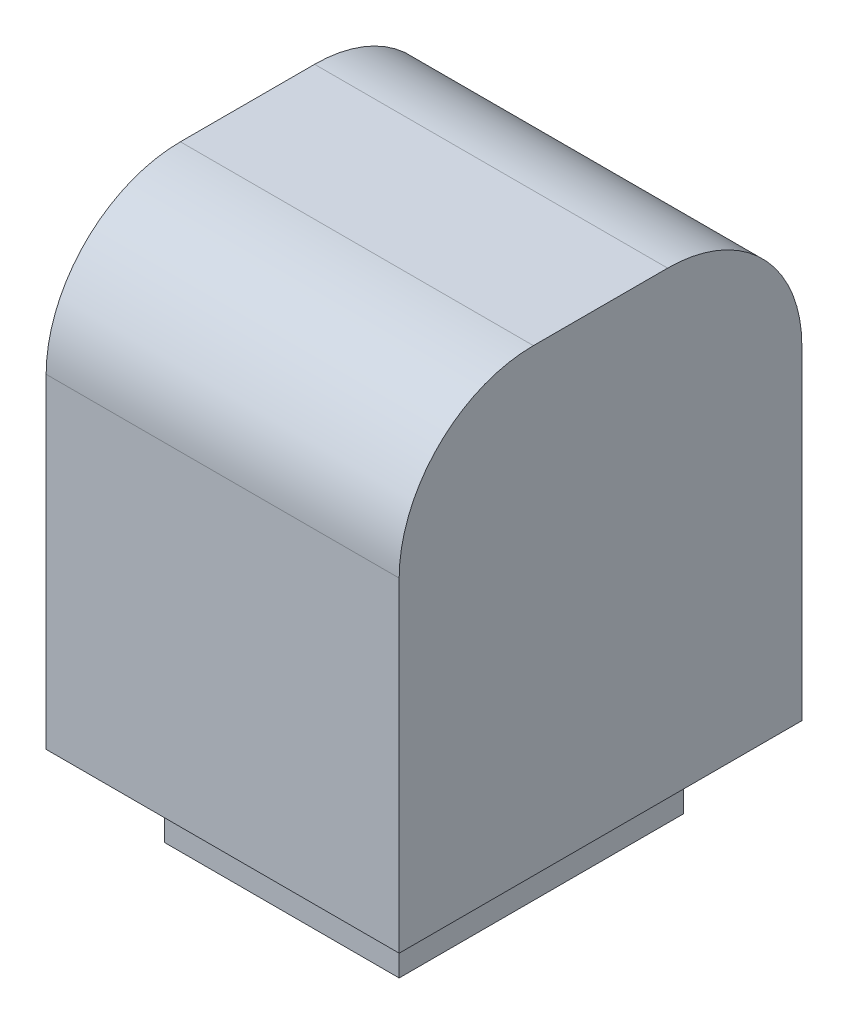
ISO-10303-21;
HEADER;
FILE_DESCRIPTION(('STEP AP214'),'2;1');
FILE_NAME('part.step','',(''),(''),'','','');
FILE_SCHEMA(('AUTOMOTIVE_DESIGN { 1 0 10303 214 1 1 1 1 }'));
ENDSEC;
DATA;
#1=APPLICATION_CONTEXT('core data for automotive mechanical design processes');
#2=APPLICATION_PROTOCOL_DEFINITION('international standard','automotive_design',2000,#1);
#3=PRODUCT_CONTEXT('',#1,'mechanical');
#4=PRODUCT('Part','Part','',(#3));
#5=PRODUCT_RELATED_PRODUCT_CATEGORY('part','',(#4));
#6=PRODUCT_DEFINITION_FORMATION('','',#4);
#7=PRODUCT_DEFINITION_CONTEXT('part definition',#1,'design');
#8=PRODUCT_DEFINITION('design','',#6,#7);
#9=PRODUCT_DEFINITION_SHAPE('','',#8);
#10=(LENGTH_UNIT() NAMED_UNIT(*) SI_UNIT(.MILLI.,.METRE.));
#11=(NAMED_UNIT(*) PLANE_ANGLE_UNIT() SI_UNIT($,.RADIAN.));
#12=(NAMED_UNIT(*) SI_UNIT($,.STERADIAN.) SOLID_ANGLE_UNIT());
#13=UNCERTAINTY_MEASURE_WITH_UNIT(LENGTH_MEASURE(1.E-05),#10,'distance_accuracy_value','');
#14=(GEOMETRIC_REPRESENTATION_CONTEXT(3) GLOBAL_UNCERTAINTY_ASSIGNED_CONTEXT((#13)) GLOBAL_UNIT_ASSIGNED_CONTEXT((#10,
#11,#12)) REPRESENTATION_CONTEXT('',''));
#15=CARTESIAN_POINT('',(0.,0.,0.));
#16=DIRECTION('',(0.,0.,1.));
#17=DIRECTION('',(1.,0.,0.));
#18=AXIS2_PLACEMENT_3D('',#15,#16,#17);
#19=CARTESIAN_POINT('',(70.4317654090223,17.6000000000002,0.));
#20=DIRECTION('',(-1.,0.,0.));
#21=DIRECTION('',(0.,-1.,0.));
#22=AXIS2_PLACEMENT_3D('',#19,#20,#21);
#23=CYLINDRICAL_SURFACE('',#22,4.4);
#24=CARTESIAN_POINT('',(21.85,17.6,0.));
#25=DIRECTION('',(-1.,0.,0.));
#26=DIRECTION('',(0.,-1.,0.));
#27=AXIS2_PLACEMENT_3D('',#24,#25,#26);
#28=CIRCLE('',#27,4.4);
#29=CARTESIAN_POINT('',(21.85,13.2,0.));
#30=VERTEX_POINT('',#29);
#31=EDGE_CURVE('E174',#30,#30,#28,.F.);
#32=CARTESIAN_POINT('',(29.2,17.6,0.));
#33=DIRECTION('',(1.,0.,0.));
#34=DIRECTION('',(0.,1.,0.));
#35=AXIS2_PLACEMENT_3D('',#32,#33,#34);
#36=CIRCLE('',#35,4.4);
#37=CARTESIAN_POINT('',(29.2,13.2,0.));
#38=VERTEX_POINT('',#37);
#39=EDGE_CURVE('E340',#38,#38,#36,.F.);
#40=CARTESIAN_POINT('',(21.85,13.2,0.));
#41=CARTESIAN_POINT('',(21.9265625,13.2,0.));
#42=CARTESIAN_POINT('',(22.003125,13.2,0.));
#43=CARTESIAN_POINT('',(22.15625,13.2,0.));
#44=CARTESIAN_POINT('',(22.2328125,13.2,0.));
#45=CARTESIAN_POINT('',(22.3859375,13.2,0.));
#46=CARTESIAN_POINT('',(22.4625,13.2,0.));
#47=CARTESIAN_POINT('',(22.615625,13.2,0.));
#48=CARTESIAN_POINT('',(22.6921875,13.2,0.));
#49=CARTESIAN_POINT('',(22.8453125,13.2,0.));
#50=CARTESIAN_POINT('',(22.921875,13.2,0.));
#51=CARTESIAN_POINT('',(23.075,13.2,0.));
#52=CARTESIAN_POINT('',(23.1515625,13.2,0.));
#53=CARTESIAN_POINT('',(23.3046875,13.2,0.));
#54=CARTESIAN_POINT('',(23.38125,13.2,0.));
#55=CARTESIAN_POINT('',(23.534375,13.2,0.));
#56=CARTESIAN_POINT('',(23.6109375,13.2,0.));
#57=CARTESIAN_POINT('',(23.7640625,13.2,0.));
#58=CARTESIAN_POINT('',(23.840625,13.2,0.));
#59=CARTESIAN_POINT('',(23.99375,13.2,0.));
#60=CARTESIAN_POINT('',(24.0703125,13.2,0.));
#61=CARTESIAN_POINT('',(24.2234375,13.2,0.));
#62=CARTESIAN_POINT('',(24.3,13.2,0.));
#63=CARTESIAN_POINT('',(24.453125,13.2,0.));
#64=CARTESIAN_POINT('',(24.5296875,13.2,0.));
#65=CARTESIAN_POINT('',(24.6828125,13.2,0.));
#66=CARTESIAN_POINT('',(24.759375,13.2,0.));
#67=CARTESIAN_POINT('',(24.9125,13.2,0.));
#68=CARTESIAN_POINT('',(24.9890625,13.2,0.));
#69=CARTESIAN_POINT('',(25.1421875,13.2,0.));
#70=CARTESIAN_POINT('',(25.21875,13.2,0.));
#71=CARTESIAN_POINT('',(25.371875,13.2,0.));
#72=CARTESIAN_POINT('',(25.4484375,13.2,0.));
#73=CARTESIAN_POINT('',(25.6015625,13.2,0.));
#74=CARTESIAN_POINT('',(25.678125,13.2,0.));
#75=CARTESIAN_POINT('',(25.83125,13.2,0.));
#76=CARTESIAN_POINT('',(25.9078125,13.2,0.));
#77=CARTESIAN_POINT('',(26.0609375,13.2,0.));
#78=CARTESIAN_POINT('',(26.1375,13.2,0.));
#79=CARTESIAN_POINT('',(26.290625,13.2,0.));
#80=CARTESIAN_POINT('',(26.3671875,13.2,0.));
#81=CARTESIAN_POINT('',(26.5203125,13.2,0.));
#82=CARTESIAN_POINT('',(26.596875,13.2,0.));
#83=CARTESIAN_POINT('',(26.75,13.2,0.));
#84=CARTESIAN_POINT('',(26.8265625,13.2,0.));
#85=CARTESIAN_POINT('',(26.9796875,13.2,0.));
#86=CARTESIAN_POINT('',(27.05625,13.2,0.));
#87=CARTESIAN_POINT('',(27.209375,13.2,0.));
#88=CARTESIAN_POINT('',(27.2859375,13.2,0.));
#89=CARTESIAN_POINT('',(27.4390625,13.2,0.));
#90=CARTESIAN_POINT('',(27.515625,13.2,0.));
#91=CARTESIAN_POINT('',(27.66875,13.2,0.));
#92=CARTESIAN_POINT('',(27.7453125,13.2,0.));
#93=CARTESIAN_POINT('',(27.8984375,13.2,0.));
#94=CARTESIAN_POINT('',(27.975,13.2,0.));
#95=CARTESIAN_POINT('',(28.128125,13.2,0.));
#96=CARTESIAN_POINT('',(28.2046875,13.2,0.));
#97=CARTESIAN_POINT('',(28.3578125,13.2,0.));
#98=CARTESIAN_POINT('',(28.434375,13.2,0.));
#99=CARTESIAN_POINT('',(28.5875,13.2,0.));
#100=CARTESIAN_POINT('',(28.6640625,13.2,0.));
#101=CARTESIAN_POINT('',(28.8171875,13.2,0.));
#102=CARTESIAN_POINT('',(28.89375,13.2,0.));
#103=CARTESIAN_POINT('',(29.046875,13.2,0.));
#104=CARTESIAN_POINT('',(29.1234375,13.2,0.));
#105=CARTESIAN_POINT('',(29.2,13.2,0.));
#106=B_SPLINE_CURVE_WITH_KNOTS('',3,(#40,#41,#42,#43,#44,#45,#46,#47,#48,#49,#50,#51,#52,#53,
#54,#55,#56,#57,#58,#59,#60,#61,#62,#63,#64,#65,#66,#67,#68,#69,#70,#71,#72,#73,#74,#75,#76,#77,
#78,#79,#80,#81,#82,#83,#84,#85,#86,#87,#88,#89,#90,#91,#92,#93,#94,#95,#96,#97,#98,#99,#100,
#101,#102,#103,#104,#105),.UNSPECIFIED.,.F.,.F.,(4,2,2,2,2,2,2,2,2,2,2,2,2,2,2,2,2,2,2,2,2,2,2,
2,2,2,2,2,2,2,2,2,4),(0.,0.229687499999999,0.459374999999998,0.689062500000004,
0.918750000000003,1.1484375,1.378125,1.6078125,1.83750000000001,2.0671875,2.296875,2.5265625,
2.75625,2.9859375,3.21562500000001,3.44531250000001,3.675,3.9046875,4.134375,4.3640625,
4.59375000000001,4.82343750000001,5.05312500000001,5.2828125,5.5125,5.74218750000001,
5.97187500000001,6.20156250000001,6.43125000000001,6.66093750000001,6.89062500000001,
7.12031250000001,7.35000000000001),.UNSPECIFIED.);
#107=EDGE_CURVE('BSEAM54',#30,#38,#106,.T.);
#108=ORIENTED_EDGE('',*,*,#31,.F.);
#109=ORIENTED_EDGE('',*,*,#39,.F.);
#110=ORIENTED_EDGE('',*,*,#107,.T.);
#111=ORIENTED_EDGE('',*,*,#107,.F.);
#112=EDGE_LOOP('',(#108,#110,#109,#111));
#113=FACE_BOUND('',#112,.T.);
#114=ADVANCED_FACE('F54',(#113),#23,.F.);
#115=CARTESIAN_POINT('',(-12.3585850404241,7.50000000000005,15.3722744776752));
#116=DIRECTION('',(0.,1.,0.));
#117=DIRECTION('',(0.,0.,1.));
#118=AXIS2_PLACEMENT_3D('',#115,#116,#117);
#119=PLANE('',#118);
#120=DIRECTION('',(0.,0.,1.));
#121=VECTOR('',#120,1.);
#122=CARTESIAN_POINT('',(35.,7.50000000000005,15.3722744776752));
#123=LINE('',#122,#121);
#124=CARTESIAN_POINT('',(35.,7.50000000000005,-7.49999999999995));
#125=VERTEX_POINT('',#124);
#126=CARTESIAN_POINT('',(35.,7.50000000000005,7.50000000000011));
#127=VERTEX_POINT('',#126);
#128=EDGE_CURVE('E159',#125,#127,#123,.T.);
#129=ORIENTED_EDGE('',*,*,#128,.T.);
#130=DIRECTION('',(1.,0.,0.));
#131=VECTOR('',#130,1.);
#132=CARTESIAN_POINT('',(70.4317654090224,7.50000000000005,7.50000000000011));
#133=LINE('',#132,#131);
#134=CARTESIAN_POINT('',(21.85,7.50000000000005,7.50000000000003));
#135=VERTEX_POINT('',#134);
#136=EDGE_CURVE('E162',#135,#127,#133,.T.);
#137=ORIENTED_EDGE('',*,*,#136,.F.);
#138=DIRECTION('',(0.,0.,-1.));
#139=VECTOR('',#138,1.);
#140=CARTESIAN_POINT('',(21.85,7.50000000000005,-0.994929888904086));
#141=LINE('',#140,#139);
#142=CARTESIAN_POINT('',(21.8500000000001,7.50000000000005,-7.50000000000002));
#143=VERTEX_POINT('',#142);
#144=EDGE_CURVE('E189',#135,#143,#141,.T.);
#145=ORIENTED_EDGE('',*,*,#144,.T.);
#146=DIRECTION('',(-1.,0.,0.));
#147=VECTOR('',#146,1.);
#148=CARTESIAN_POINT('',(70.4317654090225,7.50000000000005,-7.49999999999988));
#149=LINE('',#148,#147);
#150=EDGE_CURVE('E170',#125,#143,#149,.T.);
#151=ORIENTED_EDGE('',*,*,#150,.F.);
#152=EDGE_LOOP('',(#129,#137,#145,#151));
#153=FACE_BOUND('',#152,.T.);
#154=DIRECTION('',(0.,0.,1.));
#155=VECTOR('',#154,1.);
#156=CARTESIAN_POINT('',(32.8,7.50000000000005,5.30000000000004));
#157=LINE('',#156,#155);
#158=CARTESIAN_POINT('',(32.8,7.50000000000005,-5.29999999999995));
#159=VERTEX_POINT('',#158);
#160=CARTESIAN_POINT('',(32.8,7.50000000000005,5.30000000000004));
#161=VERTEX_POINT('',#160);
#162=EDGE_CURVE('E158',#159,#161,#157,.T.);
#163=ORIENTED_EDGE('',*,*,#162,.F.);
#164=DIRECTION('',(1.,0.,0.));
#165=VECTOR('',#164,1.);
#166=CARTESIAN_POINT('',(32.8,7.50000000000005,-5.29999999999995));
#167=LINE('',#166,#165);
#168=CARTESIAN_POINT('',(24.05,7.50000000000005,-5.29999999999995));
#169=VERTEX_POINT('',#168);
#170=EDGE_CURVE('E155',#169,#159,#167,.T.);
#171=ORIENTED_EDGE('',*,*,#170,.F.);
#172=DIRECTION('',(0.,0.,-1.));
#173=VECTOR('',#172,1.);
#174=CARTESIAN_POINT('',(24.05,7.50000000000005,5.30000000000003));
#175=LINE('',#174,#173);
#176=CARTESIAN_POINT('',(24.05,7.50000000000005,5.30000000000003));
#177=VERTEX_POINT('',#176);
#178=EDGE_CURVE('E332',#177,#169,#175,.T.);
#179=ORIENTED_EDGE('',*,*,#178,.F.);
#180=DIRECTION('',(-1.,0.,0.));
#181=VECTOR('',#180,1.);
#182=CARTESIAN_POINT('',(32.8,7.50000000000005,5.30000000000004));
#183=LINE('',#182,#181);
#184=EDGE_CURVE('E338',#161,#177,#183,.T.);
#185=ORIENTED_EDGE('',*,*,#184,.F.);
#186=EDGE_LOOP('',(#163,#171,#179,#185));
#187=FACE_BOUND('',#186,.T.);
#188=ADVANCED_FACE('F219',(#153,#187),#119,.F.);
#189=CARTESIAN_POINT('',(70.4317654090223,24.6000000000002,7.50000000000012));
#190=DIRECTION('',(0.,-1.,0.));
#191=DIRECTION('',(1.,0.,0.));
#192=AXIS2_PLACEMENT_3D('',#189,#190,#191);
#193=PLANE('',#192);
#194=DIRECTION('',(0.,0.,1.));
#195=VECTOR('',#194,1.);
#196=CARTESIAN_POINT('',(35.,24.6,7.50000000000011));
#197=LINE('',#196,#195);
#198=CARTESIAN_POINT('',(35.,24.6,-2.49999999999994));
#199=VERTEX_POINT('',#198);
#200=CARTESIAN_POINT('',(35.,24.6,2.50000000000006));
#201=VERTEX_POINT('',#200);
#202=EDGE_CURVE('E177',#199,#201,#197,.T.);
#203=ORIENTED_EDGE('',*,*,#202,.F.);
#204=DIRECTION('',(-1.,0.,0.));
#205=VECTOR('',#204,1.);
#206=CARTESIAN_POINT('',(70.4317654090223,24.6000000000002,-2.49999999999988));
#207=LINE('',#206,#205);
#208=CARTESIAN_POINT('',(21.85,24.6,-2.49999999999996));
#209=VERTEX_POINT('',#208);
#210=EDGE_CURVE('E193',#199,#209,#207,.T.);
#211=ORIENTED_EDGE('',*,*,#210,.T.);
#212=DIRECTION('',(0.,0.,1.));
#213=VECTOR('',#212,1.);
#214=CARTESIAN_POINT('',(21.85,24.6,7.50000000000001));
#215=LINE('',#214,#213);
#216=CARTESIAN_POINT('',(21.85,24.6,2.50000000000004));
#217=VERTEX_POINT('',#216);
#218=EDGE_CURVE('E180',#209,#217,#215,.T.);
#219=ORIENTED_EDGE('',*,*,#218,.T.);
#220=DIRECTION('',(-1.,0.,0.));
#221=VECTOR('',#220,1.);
#222=CARTESIAN_POINT('',(70.4317654090223,24.6000000000002,2.50000000000011));
#223=LINE('',#222,#221);
#224=EDGE_CURVE('E191',#217,#201,#223,.F.);
#225=ORIENTED_EDGE('',*,*,#224,.T.);
#226=EDGE_LOOP('',(#203,#211,#219,#225));
#227=FACE_BOUND('',#226,.T.);
#228=ADVANCED_FACE('F208',(#227),#193,.F.);
#229=CARTESIAN_POINT('',(70.4317654090225,-7.49999999999982,-7.49999999999988));
#230=DIRECTION('',(0.,0.,1.));
#231=DIRECTION('',(1.,0.,0.));
#232=AXIS2_PLACEMENT_3D('',#229,#230,#231);
#233=PLANE('',#232);
#234=DIRECTION('',(0.,1.,0.));
#235=VECTOR('',#234,1.);
#236=CARTESIAN_POINT('',(21.8500000000001,-7.49999999999999,-7.49999999999996));
#237=LINE('',#236,#235);
#238=CARTESIAN_POINT('',(21.85,19.6,-7.49999999999996));
#239=VERTEX_POINT('',#238);
#240=EDGE_CURVE('E178',#143,#239,#237,.T.);
#241=ORIENTED_EDGE('',*,*,#240,.T.);
#242=DIRECTION('',(-1.,0.,0.));
#243=VECTOR('',#242,1.);
#244=CARTESIAN_POINT('',(70.4317654090224,19.6000000000002,-7.49999999999988));
#245=LINE('',#244,#243);
#246=CARTESIAN_POINT('',(35.,19.6,-7.49999999999994));
#247=VERTEX_POINT('',#246);
#248=EDGE_CURVE('E77',#239,#247,#245,.F.);
#249=ORIENTED_EDGE('',*,*,#248,.T.);
#250=DIRECTION('',(0.,1.,0.));
#251=VECTOR('',#250,1.);
#252=CARTESIAN_POINT('',(35.,-7.49999999999982,-7.49999999999994));
#253=LINE('',#252,#251);
#254=EDGE_CURVE('E185',#125,#247,#253,.T.);
#255=ORIENTED_EDGE('',*,*,#254,.F.);
#256=ORIENTED_EDGE('',*,*,#150,.T.);
#257=EDGE_LOOP('',(#241,#249,#255,#256));
#258=FACE_BOUND('',#257,.T.);
#259=ADVANCED_FACE('F217',(#258),#233,.F.);
#260=CARTESIAN_POINT('',(70.4317654090224,-7.49999999999982,7.50000000000011));
#261=DIRECTION('',(0.,0.,-1.));
#262=DIRECTION('',(-1.,0.,0.));
#263=AXIS2_PLACEMENT_3D('',#260,#261,#262);
#264=PLANE('',#263);
#265=DIRECTION('',(0.,-1.,0.));
#266=VECTOR('',#265,1.);
#267=CARTESIAN_POINT('',(35.,-7.49999999999982,7.50000000000006));
#268=LINE('',#267,#266);
#269=CARTESIAN_POINT('',(35.,19.6,7.50000000000005));
#270=VERTEX_POINT('',#269);
#271=EDGE_CURVE('E187',#270,#127,#268,.T.);
#272=ORIENTED_EDGE('',*,*,#271,.F.);
#273=DIRECTION('',(-1.,0.,0.));
#274=VECTOR('',#273,1.);
#275=CARTESIAN_POINT('',(70.4317654090223,19.6000000000002,7.50000000000012));
#276=LINE('',#275,#274);
#277=CARTESIAN_POINT('',(21.85,19.6,7.50000000000004));
#278=VERTEX_POINT('',#277);
#279=EDGE_CURVE('E14',#270,#278,#276,.T.);
#280=ORIENTED_EDGE('',*,*,#279,.T.);
#281=DIRECTION('',(0.,-1.,0.));
#282=VECTOR('',#281,1.);
#283=CARTESIAN_POINT('',(21.8500000000001,-7.49999999999999,7.50000000000003));
#284=LINE('',#283,#282);
#285=EDGE_CURVE('E173',#278,#135,#284,.T.);
#286=ORIENTED_EDGE('',*,*,#285,.T.);
#287=ORIENTED_EDGE('',*,*,#136,.T.);
#288=EDGE_LOOP('',(#272,#280,#286,#287));
#289=FACE_BOUND('',#288,.T.);
#290=ADVANCED_FACE('F224',(#289),#264,.F.);
#291=CARTESIAN_POINT('',(35.,-7.49999999999994,-5.65333808855278));
#292=DIRECTION('',(1.,0.,0.));
#293=DIRECTION('',(0.,0.,-1.));
#294=AXIS2_PLACEMENT_3D('',#291,#292,#293);
#295=PLANE('',#294);
#296=ORIENTED_EDGE('',*,*,#254,.T.);
#297=CARTESIAN_POINT('',(35.,19.6,-2.49999999999994));
#298=DIRECTION('',(1.,0.,0.));
#299=DIRECTION('',(0.,0.,-1.));
#300=AXIS2_PLACEMENT_3D('',#297,#298,#299);
#301=CIRCLE('',#300,5.);
#302=EDGE_CURVE('E62',#247,#199,#301,.T.);
#303=ORIENTED_EDGE('',*,*,#302,.T.);
#304=ORIENTED_EDGE('',*,*,#202,.T.);
#305=CARTESIAN_POINT('',(35.,19.6,2.50000000000005));
#306=DIRECTION('',(1.,0.,0.));
#307=DIRECTION('',(0.,0.,-1.));
#308=AXIS2_PLACEMENT_3D('',#305,#306,#307);
#309=CIRCLE('',#308,5.);
#310=EDGE_CURVE('E69',#201,#270,#309,.T.);
#311=ORIENTED_EDGE('',*,*,#310,.T.);
#312=ORIENTED_EDGE('',*,*,#271,.T.);
#313=ORIENTED_EDGE('',*,*,#128,.F.);
#314=EDGE_LOOP('',(#296,#303,#304,#311,#312,#313));
#315=FACE_BOUND('',#314,.T.);
#316=ADVANCED_FACE('F203',(#315),#295,.T.);
#317=CARTESIAN_POINT('',(21.85,24.831881810162,-0.994929888904083));
#318=DIRECTION('',(-1.,0.,0.));
#319=DIRECTION('',(0.,-0.136291765603343,-0.990668741118202));
#320=AXIS2_PLACEMENT_3D('',#317,#318,#319);
#321=PLANE('',#320);
#322=ORIENTED_EDGE('',*,*,#218,.F.);
#323=CARTESIAN_POINT('',(21.85,19.6,-2.49999999999996));
#324=DIRECTION('',(-1.,0.,0.));
#325=DIRECTION('',(0.,-1.,0.));
#326=AXIS2_PLACEMENT_3D('',#323,#324,#325);
#327=CIRCLE('',#326,5.);
#328=EDGE_CURVE('E198',#209,#239,#327,.T.);
#329=ORIENTED_EDGE('',*,*,#328,.T.);
#330=ORIENTED_EDGE('',*,*,#240,.F.);
#331=ORIENTED_EDGE('',*,*,#144,.F.);
#332=ORIENTED_EDGE('',*,*,#285,.F.);
#333=CARTESIAN_POINT('',(21.85,19.6,2.50000000000004));
#334=DIRECTION('',(-1.,0.,0.));
#335=DIRECTION('',(0.,-1.,0.));
#336=AXIS2_PLACEMENT_3D('',#333,#334,#335);
#337=CIRCLE('',#336,5.);
#338=EDGE_CURVE('E196',#278,#217,#337,.T.);
#339=ORIENTED_EDGE('',*,*,#338,.T.);
#340=EDGE_LOOP('',(#322,#329,#330,#331,#332,#339));
#341=FACE_BOUND('',#340,.T.);
#342=ORIENTED_EDGE('',*,*,#31,.T.);
#343=EDGE_LOOP('',(#342));
#344=FACE_BOUND('',#343,.T.);
#345=ADVANCED_FACE('F214',(#341,#344),#321,.T.);
#346=CARTESIAN_POINT('',(32.8,4.50000000000005,5.30000000000004));
#347=DIRECTION('',(-1.,0.,0.));
#348=DIRECTION('',(0.,0.,1.));
#349=AXIS2_PLACEMENT_3D('',#346,#347,#348);
#350=PLANE('',#349);
#351=ORIENTED_EDGE('',*,*,#162,.T.);
#352=DIRECTION('',(0.,1.,0.));
#353=VECTOR('',#352,1.);
#354=CARTESIAN_POINT('',(32.8,4.50000000000005,5.30000000000004));
#355=LINE('',#354,#353);
#356=CARTESIAN_POINT('',(32.8,4.50000000000005,5.30000000000004));
#357=VERTEX_POINT('',#356);
#358=EDGE_CURVE('E139',#357,#161,#355,.T.);
#359=ORIENTED_EDGE('',*,*,#358,.F.);
#360=DIRECTION('',(0.,0.,1.));
#361=VECTOR('',#360,1.);
#362=CARTESIAN_POINT('',(32.8,4.50000000000005,5.30000000000004));
#363=LINE('',#362,#361);
#364=CARTESIAN_POINT('',(32.8,4.50000000000005,-5.29999999999995));
#365=VERTEX_POINT('',#364);
#366=EDGE_CURVE('E146',#365,#357,#363,.T.);
#367=ORIENTED_EDGE('',*,*,#366,.F.);
#368=DIRECTION('',(0.,1.,0.));
#369=VECTOR('',#368,1.);
#370=CARTESIAN_POINT('',(32.8,4.50000000000005,-5.29999999999995));
#371=LINE('',#370,#369);
#372=EDGE_CURVE('E329',#365,#159,#371,.T.);
#373=ORIENTED_EDGE('',*,*,#372,.T.);
#374=EDGE_LOOP('',(#351,#359,#367,#373));
#375=FACE_BOUND('',#374,.T.);
#376=ADVANCED_FACE('F157',(#375),#350,.F.);
#377=CARTESIAN_POINT('',(32.8,4.50000000000005,5.30000000000004));
#378=DIRECTION('',(0.,0.,-1.));
#379=DIRECTION('',(-1.,0.,0.));
#380=AXIS2_PLACEMENT_3D('',#377,#378,#379);
#381=PLANE('',#380);
#382=ORIENTED_EDGE('',*,*,#184,.T.);
#383=DIRECTION('',(0.,1.,0.));
#384=VECTOR('',#383,1.);
#385=CARTESIAN_POINT('',(24.05,4.50000000000005,5.30000000000004));
#386=LINE('',#385,#384);
#387=CARTESIAN_POINT('',(24.05,4.50000000000005,5.30000000000004));
#388=VERTEX_POINT('',#387);
#389=EDGE_CURVE('E142',#388,#177,#386,.T.);
#390=ORIENTED_EDGE('',*,*,#389,.F.);
#391=DIRECTION('',(-1.,0.,0.));
#392=VECTOR('',#391,1.);
#393=CARTESIAN_POINT('',(32.8,4.50000000000005,5.30000000000004));
#394=LINE('',#393,#392);
#395=EDGE_CURVE('E134',#357,#388,#394,.T.);
#396=ORIENTED_EDGE('',*,*,#395,.F.);
#397=ORIENTED_EDGE('',*,*,#358,.T.);
#398=EDGE_LOOP('',(#382,#390,#396,#397));
#399=FACE_BOUND('',#398,.T.);
#400=ADVANCED_FACE('F137',(#399),#381,.F.);
#401=CARTESIAN_POINT('',(24.05,4.50000000000005,5.30000000000004));
#402=DIRECTION('',(1.,0.,0.));
#403=DIRECTION('',(0.,0.,-1.));
#404=AXIS2_PLACEMENT_3D('',#401,#402,#403);
#405=PLANE('',#404);
#406=ORIENTED_EDGE('',*,*,#178,.T.);
#407=DIRECTION('',(0.,1.,0.));
#408=VECTOR('',#407,1.);
#409=CARTESIAN_POINT('',(24.05,4.50000000000005,-5.29999999999995));
#410=LINE('',#409,#408);
#411=CARTESIAN_POINT('',(24.05,4.50000000000005,-5.29999999999995));
#412=VERTEX_POINT('',#411);
#413=EDGE_CURVE('E164',#412,#169,#410,.T.);
#414=ORIENTED_EDGE('',*,*,#413,.F.);
#415=DIRECTION('',(0.,0.,-1.));
#416=VECTOR('',#415,1.);
#417=CARTESIAN_POINT('',(24.05,4.50000000000005,5.30000000000004));
#418=LINE('',#417,#416);
#419=EDGE_CURVE('E145',#388,#412,#418,.T.);
#420=ORIENTED_EDGE('',*,*,#419,.F.);
#421=ORIENTED_EDGE('',*,*,#389,.T.);
#422=EDGE_LOOP('',(#406,#414,#420,#421));
#423=FACE_BOUND('',#422,.T.);
#424=ADVANCED_FACE('F265',(#423),#405,.F.);
#425=CARTESIAN_POINT('',(32.8,4.50000000000005,-5.29999999999995));
#426=DIRECTION('',(0.,0.,1.));
#427=DIRECTION('',(1.,0.,0.));
#428=AXIS2_PLACEMENT_3D('',#425,#426,#427);
#429=PLANE('',#428);
#430=ORIENTED_EDGE('',*,*,#170,.T.);
#431=ORIENTED_EDGE('',*,*,#372,.F.);
#432=DIRECTION('',(1.,0.,0.));
#433=VECTOR('',#432,1.);
#434=CARTESIAN_POINT('',(32.8,4.50000000000005,-5.29999999999995));
#435=LINE('',#434,#433);
#436=EDGE_CURVE('E151',#412,#365,#435,.T.);
#437=ORIENTED_EDGE('',*,*,#436,.F.);
#438=ORIENTED_EDGE('',*,*,#413,.T.);
#439=EDGE_LOOP('',(#430,#431,#437,#438));
#440=FACE_BOUND('',#439,.T.);
#441=ADVANCED_FACE('F268',(#440),#429,.F.);
#442=CARTESIAN_POINT('',(0.,4.50000000000005,0.));
#443=DIRECTION('',(0.,1.,0.));
#444=DIRECTION('',(0.,0.,1.));
#445=AXIS2_PLACEMENT_3D('',#442,#443,#444);
#446=PLANE('',#445);
#447=ORIENTED_EDGE('',*,*,#366,.T.);
#448=ORIENTED_EDGE('',*,*,#395,.T.);
#449=ORIENTED_EDGE('',*,*,#419,.T.);
#450=ORIENTED_EDGE('',*,*,#436,.T.);
#451=EDGE_LOOP('',(#447,#448,#449,#450));
#452=FACE_BOUND('',#451,.T.);
#453=ADVANCED_FACE('F149',(#452),#446,.F.);
#454=CARTESIAN_POINT('',(70.4317654090223,19.6000000000002,-2.49999999999988));
#455=DIRECTION('',(-1.,0.,0.));
#456=DIRECTION('',(0.,-1.,0.));
#457=AXIS2_PLACEMENT_3D('',#454,#455,#456);
#458=CYLINDRICAL_SURFACE('',#457,5.);
#459=ORIENTED_EDGE('',*,*,#302,.F.);
#460=ORIENTED_EDGE('',*,*,#248,.F.);
#461=ORIENTED_EDGE('',*,*,#328,.F.);
#462=ORIENTED_EDGE('',*,*,#210,.F.);
#463=EDGE_LOOP('',(#459,#460,#461,#462));
#464=FACE_BOUND('',#463,.T.);
#465=ADVANCED_FACE('F211',(#464),#458,.T.);
#466=CARTESIAN_POINT('',(70.4317654090224,19.6000000000002,2.50000000000011));
#467=DIRECTION('',(-1.,0.,0.));
#468=DIRECTION('',(0.,-1.,0.));
#469=AXIS2_PLACEMENT_3D('',#466,#467,#468);
#470=CYLINDRICAL_SURFACE('',#469,5.);
#471=ORIENTED_EDGE('',*,*,#310,.F.);
#472=ORIENTED_EDGE('',*,*,#224,.F.);
#473=ORIENTED_EDGE('',*,*,#338,.F.);
#474=ORIENTED_EDGE('',*,*,#279,.F.);
#475=EDGE_LOOP('',(#471,#472,#473,#474));
#476=FACE_BOUND('',#475,.T.);
#477=ADVANCED_FACE('F56',(#476),#470,.T.);
#478=CARTESIAN_POINT('',(29.2,17.6,0.));
#479=DIRECTION('',(1.,0.,0.));
#480=DIRECTION('',(0.,-0.698106183463279,-0.71599424341983));
#481=AXIS2_PLACEMENT_3D('',#478,#479,#480);
#482=PLANE('',#481);
#483=ORIENTED_EDGE('',*,*,#39,.T.);
#484=EDGE_LOOP('',(#483));
#485=FACE_BOUND('',#484,.T.);
#486=ADVANCED_FACE('F228',(#485),#482,.F.);
#487=CLOSED_SHELL('',(#114,#188,#228,#259,#290,#316,#345,#376,#400,#424,#441,#453,#465,#477,#486));
#488=MANIFOLD_SOLID_BREP('B2',#487);
#489=ADVANCED_BREP_SHAPE_REPRESENTATION('',(#18,#488),#14);
#490=SHAPE_DEFINITION_REPRESENTATION(#9,#489);
ENDSEC;
END-ISO-10303-21;
